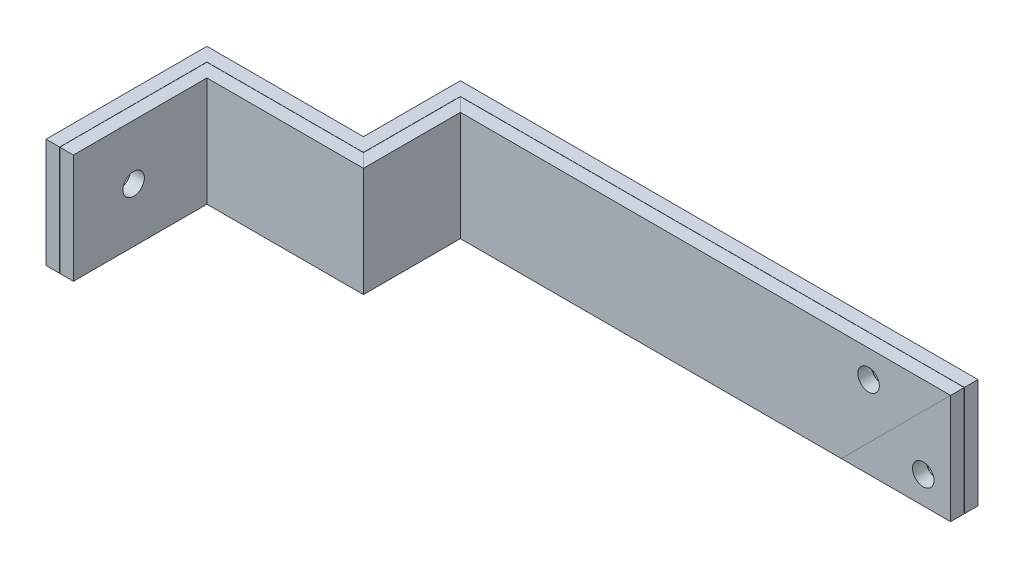
ISO-10303-21;
HEADER;
FILE_DESCRIPTION(('STEP AP214'),'2;1');
FILE_NAME('part.step','',(''),(''),'','','');
FILE_SCHEMA(('AUTOMOTIVE_DESIGN { 1 0 10303 214 1 1 1 1 }'));
ENDSEC;
DATA;
#1=APPLICATION_CONTEXT('core data for automotive mechanical design processes');
#2=APPLICATION_PROTOCOL_DEFINITION('international standard','automotive_design',2000,#1);
#3=PRODUCT_CONTEXT('',#1,'mechanical');
#4=PRODUCT('Part','Part','',(#3));
#5=PRODUCT_RELATED_PRODUCT_CATEGORY('part','',(#4));
#6=PRODUCT_DEFINITION_FORMATION('','',#4);
#7=PRODUCT_DEFINITION_CONTEXT('part definition',#1,'design');
#8=PRODUCT_DEFINITION('design','',#6,#7);
#9=PRODUCT_DEFINITION_SHAPE('','',#8);
#10=(LENGTH_UNIT() NAMED_UNIT(*) SI_UNIT(.MILLI.,.METRE.));
#11=(NAMED_UNIT(*) PLANE_ANGLE_UNIT() SI_UNIT($,.RADIAN.));
#12=(NAMED_UNIT(*) SI_UNIT($,.STERADIAN.) SOLID_ANGLE_UNIT());
#13=UNCERTAINTY_MEASURE_WITH_UNIT(LENGTH_MEASURE(1.E-05),#10,'distance_accuracy_value','');
#14=(GEOMETRIC_REPRESENTATION_CONTEXT(3) GLOBAL_UNCERTAINTY_ASSIGNED_CONTEXT((#13)) GLOBAL_UNIT_ASSIGNED_CONTEXT((#10,
#11,#12)) REPRESENTATION_CONTEXT('',''));
#15=CARTESIAN_POINT('',(0.,0.,0.));
#16=DIRECTION('',(0.,0.,1.));
#17=DIRECTION('',(1.,0.,0.));
#18=AXIS2_PLACEMENT_3D('',#15,#16,#17);
#19=CARTESIAN_POINT('',(-0.0999999999999925,25.4,65.155));
#20=DIRECTION('',(0.,0.,1.));
#21=DIRECTION('',(1.,0.,0.));
#22=AXIS2_PLACEMENT_3D('',#19,#20,#21);
#23=PLANE('',#22);
#24=DIRECTION('',(-1.,0.,0.));
#25=VECTOR('',#24,1.);
#26=CARTESIAN_POINT('',(-0.0999999999999925,-25.4,65.155));
#27=LINE('',#26,#25);
#28=CARTESIAN_POINT('',(-0.0999999999999925,-25.4,65.155));
#29=VERTEX_POINT('',#28);
#30=CARTESIAN_POINT('',(-6.41,-25.4,65.155));
#31=VERTEX_POINT('',#30);
#32=EDGE_CURVE('E182',#29,#31,#27,.T.);
#33=ORIENTED_EDGE('',*,*,#32,.F.);
#34=DIRECTION('',(0.,-1.,0.));
#35=VECTOR('',#34,1.);
#36=CARTESIAN_POINT('',(-0.0999999999999925,25.4,65.155));
#37=LINE('',#36,#35);
#38=CARTESIAN_POINT('',(-0.0999999999999925,25.4,65.155));
#39=VERTEX_POINT('',#38);
#40=EDGE_CURVE('E12',#39,#29,#37,.T.);
#41=ORIENTED_EDGE('',*,*,#40,.F.);
#42=DIRECTION('',(-1.,0.,0.));
#43=VECTOR('',#42,1.);
#44=CARTESIAN_POINT('',(-1.92553323385334,25.4,65.155));
#45=LINE('',#44,#43);
#46=CARTESIAN_POINT('',(-6.41,25.4,65.155));
#47=VERTEX_POINT('',#46);
#48=EDGE_CURVE('E65',#39,#47,#45,.T.);
#49=ORIENTED_EDGE('',*,*,#48,.T.);
#50=DIRECTION('',(0.,-1.,0.));
#51=VECTOR('',#50,1.);
#52=CARTESIAN_POINT('',(-6.41,25.4,65.155));
#53=LINE('',#52,#51);
#54=EDGE_CURVE('E112',#47,#31,#53,.T.);
#55=ORIENTED_EDGE('',*,*,#54,.T.);
#56=EDGE_LOOP('',(#33,#41,#49,#55));
#57=FACE_BOUND('',#56,.T.);
#58=ADVANCED_FACE('F46',(#57),#23,.T.);
#59=CARTESIAN_POINT('',(-0.0999999999999925,25.4,-3.255));
#60=DIRECTION('',(1.,0.,0.));
#61=DIRECTION('',(0.,0.,-1.));
#62=AXIS2_PLACEMENT_3D('',#59,#60,#61);
#63=PLANE('',#62);
#64=CARTESIAN_POINT('',(-0.0999999999999925,-0.172201783301577,37.1950000000231));
#65=DIRECTION('',(1.,0.,0.));
#66=DIRECTION('',(0.,0.,-1.));
#67=AXIS2_PLACEMENT_3D('',#64,#65,#66);
#68=CIRCLE('',#67,5.);
#69=CARTESIAN_POINT('',(-0.0999999999999925,-0.172201783301577,32.1950000000231));
#70=VERTEX_POINT('',#69);
#71=EDGE_CURVE('E162',#70,#70,#68,.T.);
#72=ORIENTED_EDGE('',*,*,#71,.F.);
#73=EDGE_LOOP('',(#72));
#74=FACE_BOUND('',#73,.T.);
#75=DIRECTION('',(0.,0.,1.));
#76=VECTOR('',#75,1.);
#77=CARTESIAN_POINT('',(-0.0999999999999925,-25.4,-3.255));
#78=LINE('',#77,#76);
#79=CARTESIAN_POINT('',(-0.0999999999999925,-25.4,-3.255));
#80=VERTEX_POINT('',#79);
#81=EDGE_CURVE('E180',#80,#29,#78,.T.);
#82=ORIENTED_EDGE('',*,*,#81,.F.);
#83=DIRECTION('',(0.,-1.,0.));
#84=VECTOR('',#83,1.);
#85=CARTESIAN_POINT('',(-0.0999999999999925,25.4,-3.255));
#86=LINE('',#85,#84);
#87=CARTESIAN_POINT('',(-0.0999999999999925,25.4,-3.255));
#88=VERTEX_POINT('',#87);
#89=EDGE_CURVE('E56',#88,#80,#86,.T.);
#90=ORIENTED_EDGE('',*,*,#89,.F.);
#91=DIRECTION('',(0.,0.,1.));
#92=VECTOR('',#91,1.);
#93=CARTESIAN_POINT('',(-0.0999999999999925,25.4,-3.255));
#94=LINE('',#93,#92);
#95=EDGE_CURVE('E148',#88,#39,#94,.T.);
#96=ORIENTED_EDGE('',*,*,#95,.T.);
#97=ORIENTED_EDGE('',*,*,#40,.T.);
#98=EDGE_LOOP('',(#82,#90,#96,#97));
#99=FACE_BOUND('',#98,.T.);
#100=ADVANCED_FACE('F246',(#74,#99),#63,.T.);
#101=CARTESIAN_POINT('',(-0.0999999999999925,25.4,-3.255));
#102=DIRECTION('',(0.,0.,1.));
#103=DIRECTION('',(1.,0.,0.));
#104=AXIS2_PLACEMENT_3D('',#101,#102,#103);
#105=PLANE('',#104);
#106=DIRECTION('',(-1.,0.,0.));
#107=VECTOR('',#106,1.);
#108=CARTESIAN_POINT('',(-0.0999999999999925,-25.4,-3.255));
#109=LINE('',#108,#107);
#110=CARTESIAN_POINT('',(72.585,-25.4,-3.255));
#111=VERTEX_POINT('',#110);
#112=EDGE_CURVE('E136',#111,#80,#109,.T.);
#113=ORIENTED_EDGE('',*,*,#112,.F.);
#114=DIRECTION('',(0.,-1.,0.));
#115=VECTOR('',#114,1.);
#116=CARTESIAN_POINT('',(72.585,25.4,-3.255));
#117=LINE('',#116,#115);
#118=CARTESIAN_POINT('',(72.585,25.4,-3.255));
#119=VERTEX_POINT('',#118);
#120=EDGE_CURVE('E131',#119,#111,#117,.T.);
#121=ORIENTED_EDGE('',*,*,#120,.F.);
#122=DIRECTION('',(-1.,0.,0.));
#123=VECTOR('',#122,1.);
#124=CARTESIAN_POINT('',(-0.0999999999999925,25.4,-3.255));
#125=LINE('',#124,#123);
#126=EDGE_CURVE('E134',#119,#88,#125,.T.);
#127=ORIENTED_EDGE('',*,*,#126,.T.);
#128=ORIENTED_EDGE('',*,*,#89,.T.);
#129=EDGE_LOOP('',(#113,#121,#127,#128));
#130=FACE_BOUND('',#129,.T.);
#131=ADVANCED_FACE('F133',(#130),#105,.T.);
#132=CARTESIAN_POINT('',(72.585,25.4,-3.255));
#133=DIRECTION('',(1.,0.,0.));
#134=DIRECTION('',(0.,0.,-1.));
#135=AXIS2_PLACEMENT_3D('',#132,#133,#134);
#136=PLANE('',#135);
#137=DIRECTION('',(0.,0.,1.));
#138=VECTOR('',#137,1.);
#139=CARTESIAN_POINT('',(72.585,-25.4,-3.255));
#140=LINE('',#139,#138);
#141=CARTESIAN_POINT('',(72.585,-25.4,-48.255));
#142=VERTEX_POINT('',#141);
#143=EDGE_CURVE('E177',#142,#111,#140,.T.);
#144=ORIENTED_EDGE('',*,*,#143,.F.);
#145=DIRECTION('',(0.,-1.,0.));
#146=VECTOR('',#145,1.);
#147=CARTESIAN_POINT('',(72.585,25.4,-48.255));
#148=LINE('',#147,#146);
#149=CARTESIAN_POINT('',(72.585,25.4,-48.255));
#150=VERTEX_POINT('',#149);
#151=EDGE_CURVE('E141',#150,#142,#148,.T.);
#152=ORIENTED_EDGE('',*,*,#151,.F.);
#153=DIRECTION('',(0.,0.,1.));
#154=VECTOR('',#153,1.);
#155=CARTESIAN_POINT('',(72.585,25.4,-3.255));
#156=LINE('',#155,#154);
#157=EDGE_CURVE('E146',#150,#119,#156,.T.);
#158=ORIENTED_EDGE('',*,*,#157,.T.);
#159=ORIENTED_EDGE('',*,*,#120,.T.);
#160=EDGE_LOOP('',(#144,#152,#158,#159));
#161=FACE_BOUND('',#160,.T.);
#162=ADVANCED_FACE('F150',(#161),#136,.T.);
#163=CARTESIAN_POINT('',(72.585,25.4,-48.255));
#164=DIRECTION('',(0.,0.,1.));
#165=DIRECTION('',(1.,0.,0.));
#166=AXIS2_PLACEMENT_3D('',#163,#164,#165);
#167=PLANE('',#166);
#168=CARTESIAN_POINT('',(293.93,-12.7,-48.255));
#169=DIRECTION('',(0.,0.,1.));
#170=DIRECTION('',(1.,0.,0.));
#171=AXIS2_PLACEMENT_3D('',#168,#169,#170);
#172=CIRCLE('',#171,4.99999999999999);
#173=CARTESIAN_POINT('',(298.93,-12.7,-48.255));
#174=VERTEX_POINT('',#173);
#175=EDGE_CURVE('E199',#174,#174,#172,.T.);
#176=ORIENTED_EDGE('',*,*,#175,.F.);
#177=EDGE_LOOP('',(#176));
#178=FACE_BOUND('',#177,.T.);
#179=CARTESIAN_POINT('',(268.53,12.7,-48.255));
#180=DIRECTION('',(0.,0.,1.));
#181=DIRECTION('',(1.,0.,0.));
#182=AXIS2_PLACEMENT_3D('',#179,#180,#181);
#183=CIRCLE('',#182,4.99999999999999);
#184=CARTESIAN_POINT('',(273.53,12.7,-48.255));
#185=VERTEX_POINT('',#184);
#186=EDGE_CURVE('E202',#185,#185,#183,.T.);
#187=ORIENTED_EDGE('',*,*,#186,.F.);
#188=EDGE_LOOP('',(#187));
#189=FACE_BOUND('',#188,.T.);
#190=DIRECTION('',(-1.,0.,0.));
#191=VECTOR('',#190,1.);
#192=CARTESIAN_POINT('',(72.585,-25.4,-48.255));
#193=LINE('',#192,#191);
#194=CARTESIAN_POINT('',(306.63,-25.4,-48.255));
#195=VERTEX_POINT('',#194);
#196=EDGE_CURVE('E174',#195,#142,#193,.T.);
#197=ORIENTED_EDGE('',*,*,#196,.F.);
#198=DIRECTION('',(0.,-1.,0.));
#199=VECTOR('',#198,1.);
#200=CARTESIAN_POINT('',(306.63,25.4,-48.255));
#201=LINE('',#200,#199);
#202=CARTESIAN_POINT('',(306.63,25.4,-48.255));
#203=VERTEX_POINT('',#202);
#204=EDGE_CURVE('E186',#203,#195,#201,.T.);
#205=ORIENTED_EDGE('',*,*,#204,.F.);
#206=DIRECTION('',(-1.,0.,0.));
#207=VECTOR('',#206,1.);
#208=CARTESIAN_POINT('',(72.585,25.4,-48.255));
#209=LINE('',#208,#207);
#210=EDGE_CURVE('E151',#203,#150,#209,.T.);
#211=ORIENTED_EDGE('',*,*,#210,.T.);
#212=ORIENTED_EDGE('',*,*,#151,.T.);
#213=EDGE_LOOP('',(#197,#205,#211,#212));
#214=FACE_BOUND('',#213,.T.);
#215=ADVANCED_FACE('F250',(#178,#189,#214),#167,.T.);
#216=CARTESIAN_POINT('',(306.63,25.4,-48.255));
#217=DIRECTION('',(1.,0.,0.));
#218=DIRECTION('',(0.,0.,-1.));
#219=AXIS2_PLACEMENT_3D('',#216,#217,#218);
#220=PLANE('',#219);
#221=DIRECTION('',(0.,0.,1.));
#222=VECTOR('',#221,1.);
#223=CARTESIAN_POINT('',(306.63,-25.4,-48.255));
#224=LINE('',#223,#222);
#225=CARTESIAN_POINT('',(306.63,-25.4,-54.565));
#226=VERTEX_POINT('',#225);
#227=EDGE_CURVE('E171',#226,#195,#224,.T.);
#228=ORIENTED_EDGE('',*,*,#227,.F.);
#229=DIRECTION('',(0.,-1.,0.));
#230=VECTOR('',#229,1.);
#231=CARTESIAN_POINT('',(306.63,25.4,-54.565));
#232=LINE('',#231,#230);
#233=CARTESIAN_POINT('',(306.63,25.4,-54.565));
#234=VERTEX_POINT('',#233);
#235=EDGE_CURVE('E188',#234,#226,#232,.T.);
#236=ORIENTED_EDGE('',*,*,#235,.F.);
#237=DIRECTION('',(0.,0.,1.));
#238=VECTOR('',#237,1.);
#239=CARTESIAN_POINT('',(306.63,25.4,-48.255));
#240=LINE('',#239,#238);
#241=EDGE_CURVE('E153',#234,#203,#240,.T.);
#242=ORIENTED_EDGE('',*,*,#241,.T.);
#243=ORIENTED_EDGE('',*,*,#204,.T.);
#244=EDGE_LOOP('',(#228,#236,#242,#243));
#245=FACE_BOUND('',#244,.T.);
#246=ADVANCED_FACE('F230',(#245),#220,.T.);
#247=CARTESIAN_POINT('',(66.275,25.4,-54.565));
#248=DIRECTION('',(0.,0.,-1.));
#249=DIRECTION('',(-1.,0.,0.));
#250=AXIS2_PLACEMENT_3D('',#247,#248,#249);
#251=PLANE('',#250);
#252=CARTESIAN_POINT('',(293.93,-12.7,-54.565));
#253=DIRECTION('',(0.,0.,-1.));
#254=DIRECTION('',(-1.,0.,0.));
#255=AXIS2_PLACEMENT_3D('',#252,#253,#254);
#256=CIRCLE('',#255,4.99999999999999);
#257=CARTESIAN_POINT('',(288.93,-12.7,-54.565));
#258=VERTEX_POINT('',#257);
#259=EDGE_CURVE('E50',#258,#258,#256,.T.);
#260=ORIENTED_EDGE('',*,*,#259,.F.);
#261=EDGE_LOOP('',(#260));
#262=FACE_BOUND('',#261,.T.);
#263=CARTESIAN_POINT('',(268.53,12.7,-54.565));
#264=DIRECTION('',(0.,0.,-1.));
#265=DIRECTION('',(-1.,0.,0.));
#266=AXIS2_PLACEMENT_3D('',#263,#264,#265);
#267=CIRCLE('',#266,4.99999999999999);
#268=CARTESIAN_POINT('',(263.53,12.7,-54.565));
#269=VERTEX_POINT('',#268);
#270=EDGE_CURVE('E200',#269,#269,#267,.T.);
#271=ORIENTED_EDGE('',*,*,#270,.F.);
#272=EDGE_LOOP('',(#271));
#273=FACE_BOUND('',#272,.T.);
#274=DIRECTION('',(1.,0.,0.));
#275=VECTOR('',#274,1.);
#276=CARTESIAN_POINT('',(66.275,-25.4,-54.565));
#277=LINE('',#276,#275);
#278=CARTESIAN_POINT('',(66.275,-25.4,-54.565));
#279=VERTEX_POINT('',#278);
#280=EDGE_CURVE('E168',#279,#226,#277,.T.);
#281=ORIENTED_EDGE('',*,*,#280,.F.);
#282=DIRECTION('',(0.,-1.,0.));
#283=VECTOR('',#282,1.);
#284=CARTESIAN_POINT('',(66.275,25.4,-54.565));
#285=LINE('',#284,#283);
#286=CARTESIAN_POINT('',(66.275,25.4,-54.565));
#287=VERTEX_POINT('',#286);
#288=EDGE_CURVE('E190',#287,#279,#285,.T.);
#289=ORIENTED_EDGE('',*,*,#288,.F.);
#290=DIRECTION('',(1.,0.,0.));
#291=VECTOR('',#290,1.);
#292=CARTESIAN_POINT('',(66.275,25.4,-54.565));
#293=LINE('',#292,#291);
#294=EDGE_CURVE('E224',#287,#234,#293,.T.);
#295=ORIENTED_EDGE('',*,*,#294,.T.);
#296=ORIENTED_EDGE('',*,*,#235,.T.);
#297=EDGE_LOOP('',(#281,#289,#295,#296));
#298=FACE_BOUND('',#297,.T.);
#299=ADVANCED_FACE('F236',(#262,#273,#298),#251,.T.);
#300=CARTESIAN_POINT('',(66.275,25.4,-9.565));
#301=DIRECTION('',(-1.,0.,0.));
#302=DIRECTION('',(0.,0.,1.));
#303=AXIS2_PLACEMENT_3D('',#300,#301,#302);
#304=PLANE('',#303);
#305=DIRECTION('',(0.,0.,-1.));
#306=VECTOR('',#305,1.);
#307=CARTESIAN_POINT('',(66.275,-25.4,-9.565));
#308=LINE('',#307,#306);
#309=CARTESIAN_POINT('',(66.275,-25.4,-9.565));
#310=VERTEX_POINT('',#309);
#311=EDGE_CURVE('E165',#310,#279,#308,.T.);
#312=ORIENTED_EDGE('',*,*,#311,.F.);
#313=DIRECTION('',(0.,-1.,0.));
#314=VECTOR('',#313,1.);
#315=CARTESIAN_POINT('',(66.275,25.4,-9.565));
#316=LINE('',#315,#314);
#317=CARTESIAN_POINT('',(66.275,25.4,-9.565));
#318=VERTEX_POINT('',#317);
#319=EDGE_CURVE('E192',#318,#310,#316,.T.);
#320=ORIENTED_EDGE('',*,*,#319,.F.);
#321=DIRECTION('',(0.,0.,-1.));
#322=VECTOR('',#321,1.);
#323=CARTESIAN_POINT('',(66.275,25.4,-9.565));
#324=LINE('',#323,#322);
#325=EDGE_CURVE('E221',#318,#287,#324,.T.);
#326=ORIENTED_EDGE('',*,*,#325,.T.);
#327=ORIENTED_EDGE('',*,*,#288,.T.);
#328=EDGE_LOOP('',(#312,#320,#326,#327));
#329=FACE_BOUND('',#328,.T.);
#330=ADVANCED_FACE('F239',(#329),#304,.T.);
#331=CARTESIAN_POINT('',(-6.40999999999999,25.4,-9.565));
#332=DIRECTION('',(0.,0.,-1.));
#333=DIRECTION('',(-1.,0.,0.));
#334=AXIS2_PLACEMENT_3D('',#331,#332,#333);
#335=PLANE('',#334);
#336=DIRECTION('',(1.,0.,0.));
#337=VECTOR('',#336,1.);
#338=CARTESIAN_POINT('',(-6.40999999999999,-25.4,-9.565));
#339=LINE('',#338,#337);
#340=CARTESIAN_POINT('',(-6.40999999999999,-25.4,-9.565));
#341=VERTEX_POINT('',#340);
#342=EDGE_CURVE('E161',#341,#310,#339,.T.);
#343=ORIENTED_EDGE('',*,*,#342,.F.);
#344=DIRECTION('',(0.,-1.,0.));
#345=VECTOR('',#344,1.);
#346=CARTESIAN_POINT('',(-6.40999999999999,25.4,-9.565));
#347=LINE('',#346,#345);
#348=CARTESIAN_POINT('',(-6.40999999999999,25.4,-9.565));
#349=VERTEX_POINT('',#348);
#350=EDGE_CURVE('E194',#349,#341,#347,.T.);
#351=ORIENTED_EDGE('',*,*,#350,.F.);
#352=DIRECTION('',(1.,0.,0.));
#353=VECTOR('',#352,1.);
#354=CARTESIAN_POINT('',(-6.40999999999999,25.4,-9.565));
#355=LINE('',#354,#353);
#356=EDGE_CURVE('E218',#349,#318,#355,.T.);
#357=ORIENTED_EDGE('',*,*,#356,.T.);
#358=ORIENTED_EDGE('',*,*,#319,.T.);
#359=EDGE_LOOP('',(#343,#351,#357,#358));
#360=FACE_BOUND('',#359,.T.);
#361=ADVANCED_FACE('F243',(#360),#335,.T.);
#362=CARTESIAN_POINT('',(-6.41,25.4,65.155));
#363=DIRECTION('',(-1.,0.,0.));
#364=DIRECTION('',(0.,0.,1.));
#365=AXIS2_PLACEMENT_3D('',#362,#363,#364);
#366=PLANE('',#365);
#367=CARTESIAN_POINT('',(-6.41,-0.172201783301577,37.1950000000231));
#368=DIRECTION('',(-1.,0.,0.));
#369=DIRECTION('',(0.,0.,1.));
#370=AXIS2_PLACEMENT_3D('',#367,#368,#369);
#371=CIRCLE('',#370,5.);
#372=CARTESIAN_POINT('',(-6.41,-0.172201783301577,42.1950000000231));
#373=VERTEX_POINT('',#372);
#374=EDGE_CURVE('E197',#373,#373,#371,.T.);
#375=ORIENTED_EDGE('',*,*,#374,.F.);
#376=EDGE_LOOP('',(#375));
#377=FACE_BOUND('',#376,.T.);
#378=DIRECTION('',(0.,0.,-1.));
#379=VECTOR('',#378,1.);
#380=CARTESIAN_POINT('',(-6.41,-25.4,65.155));
#381=LINE('',#380,#379);
#382=EDGE_CURVE('E158',#31,#341,#381,.T.);
#383=ORIENTED_EDGE('',*,*,#382,.F.);
#384=ORIENTED_EDGE('',*,*,#54,.F.);
#385=DIRECTION('',(0.,0.,-1.));
#386=VECTOR('',#385,1.);
#387=CARTESIAN_POINT('',(-6.41,25.4,65.155));
#388=LINE('',#387,#386);
#389=EDGE_CURVE('E216',#47,#349,#388,.T.);
#390=ORIENTED_EDGE('',*,*,#389,.T.);
#391=ORIENTED_EDGE('',*,*,#350,.T.);
#392=EDGE_LOOP('',(#383,#384,#390,#391));
#393=FACE_BOUND('',#392,.T.);
#394=ADVANCED_FACE('F48',(#377,#393),#366,.T.);
#395=CARTESIAN_POINT('',(0.,25.4,0.));
#396=DIRECTION('',(0.,-1.,0.));
#397=DIRECTION('',(0.,0.,-1.));
#398=AXIS2_PLACEMENT_3D('',#395,#396,#397);
#399=PLANE('',#398);
#400=ORIENTED_EDGE('',*,*,#48,.F.);
#401=ORIENTED_EDGE('',*,*,#95,.F.);
#402=ORIENTED_EDGE('',*,*,#126,.F.);
#403=ORIENTED_EDGE('',*,*,#157,.F.);
#404=ORIENTED_EDGE('',*,*,#210,.F.);
#405=ORIENTED_EDGE('',*,*,#241,.F.);
#406=ORIENTED_EDGE('',*,*,#294,.F.);
#407=ORIENTED_EDGE('',*,*,#325,.F.);
#408=ORIENTED_EDGE('',*,*,#356,.F.);
#409=ORIENTED_EDGE('',*,*,#389,.F.);
#410=EDGE_LOOP('',(#400,#401,#402,#403,#404,#405,#406,#407,#408,#409));
#411=FACE_BOUND('',#410,.T.);
#412=ADVANCED_FACE('F144',(#411),#399,.F.);
#413=CARTESIAN_POINT('',(0.,-25.4,0.));
#414=DIRECTION('',(0.,-1.,0.));
#415=DIRECTION('',(0.,0.,-1.));
#416=AXIS2_PLACEMENT_3D('',#413,#414,#415);
#417=PLANE('',#416);
#418=ORIENTED_EDGE('',*,*,#32,.T.);
#419=ORIENTED_EDGE('',*,*,#382,.T.);
#420=ORIENTED_EDGE('',*,*,#342,.T.);
#421=ORIENTED_EDGE('',*,*,#311,.T.);
#422=ORIENTED_EDGE('',*,*,#280,.T.);
#423=ORIENTED_EDGE('',*,*,#227,.T.);
#424=ORIENTED_EDGE('',*,*,#196,.T.);
#425=ORIENTED_EDGE('',*,*,#143,.T.);
#426=ORIENTED_EDGE('',*,*,#112,.T.);
#427=ORIENTED_EDGE('',*,*,#81,.T.);
#428=EDGE_LOOP('',(#418,#419,#420,#421,#422,#423,#424,#425,#426,#427));
#429=FACE_BOUND('',#428,.T.);
#430=ADVANCED_FACE('F248',(#429),#417,.T.);
#431=CARTESIAN_POINT('',(-18.215,-0.172201783301577,37.1950000000231));
#432=DIRECTION('',(1.,0.,0.));
#433=DIRECTION('',(0.,0.,-1.));
#434=AXIS2_PLACEMENT_3D('',#431,#432,#433);
#435=CYLINDRICAL_SURFACE('',#434,5.);
#436=ORIENTED_EDGE('',*,*,#71,.T.);
#437=EDGE_LOOP('',(#436));
#438=FACE_BOUND('',#437,.T.);
#439=ORIENTED_EDGE('',*,*,#374,.T.);
#440=EDGE_LOOP('',(#439));
#441=FACE_BOUND('',#440,.T.);
#442=ADVANCED_FACE('F324',(#438,#441),#435,.F.);
#443=CARTESIAN_POINT('',(268.53,12.7,-76.845));
#444=DIRECTION('',(0.,0.,1.));
#445=DIRECTION('',(1.,0.,0.));
#446=AXIS2_PLACEMENT_3D('',#443,#444,#445);
#447=CYLINDRICAL_SURFACE('',#446,4.99999999999999);
#448=ORIENTED_EDGE('',*,*,#186,.T.);
#449=EDGE_LOOP('',(#448));
#450=FACE_BOUND('',#449,.T.);
#451=ORIENTED_EDGE('',*,*,#270,.T.);
#452=EDGE_LOOP('',(#451));
#453=FACE_BOUND('',#452,.T.);
#454=ADVANCED_FACE('F345',(#450,#453),#447,.F.);
#455=CARTESIAN_POINT('',(293.93,-12.7,-76.845));
#456=DIRECTION('',(0.,0.,1.));
#457=DIRECTION('',(1.,0.,0.));
#458=AXIS2_PLACEMENT_3D('',#455,#456,#457);
#459=CYLINDRICAL_SURFACE('',#458,4.99999999999999);
#460=ORIENTED_EDGE('',*,*,#175,.T.);
#461=EDGE_LOOP('',(#460));
#462=FACE_BOUND('',#461,.T.);
#463=ORIENTED_EDGE('',*,*,#259,.T.);
#464=EDGE_LOOP('',(#463));
#465=FACE_BOUND('',#464,.T.);
#466=ADVANCED_FACE('F366',(#462,#465),#459,.F.);
#467=CLOSED_SHELL('',(#58,#100,#131,#162,#215,#246,#299,#330,#361,#394,#412,#430,#442,#454,#466));
#468=MANIFOLD_SOLID_BREP('B2',#467);
#469=CARTESIAN_POINT('',(0.,0.,0.));
#470=DIRECTION('',(1.,0.,0.));
#471=DIRECTION('',(0.,0.,-1.));
#472=AXIS2_PLACEMENT_3D('',#469,#470,#471);
#473=PLANE('',#472);
#474=CARTESIAN_POINT('',(0.,-0.172201783301577,37.1950000000231));
#475=DIRECTION('',(1.,0.,0.));
#476=DIRECTION('',(0.,0.,-1.));
#477=AXIS2_PLACEMENT_3D('',#474,#475,#476);
#478=CIRCLE('',#477,5.);
#479=CARTESIAN_POINT('',(0.,-0.172201783301577,32.1950000000231));
#480=VERTEX_POINT('',#479);
#481=EDGE_CURVE('E643',#480,#480,#478,.T.);
#482=ORIENTED_EDGE('',*,*,#481,.T.);
#483=EDGE_LOOP('',(#482));
#484=FACE_BOUND('',#483,.T.);
#485=DIRECTION('',(0.,-1.,0.));
#486=VECTOR('',#485,1.);
#487=CARTESIAN_POINT('',(0.,25.4,65.155));
#488=LINE('',#487,#486);
#489=CARTESIAN_POINT('',(0.,25.4,65.155));
#490=VERTEX_POINT('',#489);
#491=CARTESIAN_POINT('',(0.,-25.4,65.155));
#492=VERTEX_POINT('',#491);
#493=EDGE_CURVE('E609',#490,#492,#488,.T.);
#494=ORIENTED_EDGE('',*,*,#493,.F.);
#495=DIRECTION('',(0.,0.,1.));
#496=VECTOR('',#495,1.);
#497=CARTESIAN_POINT('',(0.,25.4,3.155));
#498=LINE('',#497,#496);
#499=CARTESIAN_POINT('',(0.,25.4,-3.155));
#500=VERTEX_POINT('',#499);
#501=EDGE_CURVE('E549',#500,#490,#498,.T.);
#502=ORIENTED_EDGE('',*,*,#501,.F.);
#503=DIRECTION('',(0.,1.,0.));
#504=VECTOR('',#503,1.);
#505=CARTESIAN_POINT('',(0.,25.4,-3.155));
#506=LINE('',#505,#504);
#507=CARTESIAN_POINT('',(0.,-25.4,-3.155));
#508=VERTEX_POINT('',#507);
#509=EDGE_CURVE('E602',#508,#500,#506,.T.);
#510=ORIENTED_EDGE('',*,*,#509,.F.);
#511=DIRECTION('',(0.,0.,-1.));
#512=VECTOR('',#511,1.);
#513=CARTESIAN_POINT('',(0.,-25.4,3.155));
#514=LINE('',#513,#512);
#515=EDGE_CURVE('E577',#492,#508,#514,.T.);
#516=ORIENTED_EDGE('',*,*,#515,.F.);
#517=EDGE_LOOP('',(#494,#502,#510,#516));
#518=FACE_BOUND('',#517,.T.);
#519=ADVANCED_FACE('F399',(#484,#518),#473,.F.);
#520=CARTESIAN_POINT('',(306.63,28.0399999999999,-41.845));
#521=DIRECTION('',(0.,0.,1.));
#522=DIRECTION('',(1.,0.,0.));
#523=AXIS2_PLACEMENT_3D('',#520,#521,#522);
#524=PLANE('',#523);
#525=CARTESIAN_POINT('',(293.93,-12.7,-41.845));
#526=DIRECTION('',(0.,0.,1.));
#527=DIRECTION('',(1.,0.,0.));
#528=AXIS2_PLACEMENT_3D('',#525,#526,#527);
#529=CIRCLE('',#528,4.99999999999999);
#530=CARTESIAN_POINT('',(298.93,-12.7,-41.845));
#531=VERTEX_POINT('',#530);
#532=EDGE_CURVE('E690',#531,#531,#529,.T.);
#533=ORIENTED_EDGE('',*,*,#532,.F.);
#534=EDGE_LOOP('',(#533));
#535=FACE_BOUND('',#534,.T.);
#536=DIRECTION('',(-1.,0.,0.));
#537=VECTOR('',#536,1.);
#538=CARTESIAN_POINT('',(306.63,-25.4000000000001,-41.845));
#539=LINE('',#538,#537);
#540=CARTESIAN_POINT('',(306.63,-25.4000000000001,-41.845));
#541=VERTEX_POINT('',#540);
#542=CARTESIAN_POINT('',(255.83,-25.4000000000001,-41.845));
#543=VERTEX_POINT('',#542);
#544=EDGE_CURVE('E511',#541,#543,#539,.T.);
#545=ORIENTED_EDGE('',*,*,#544,.F.);
#546=DIRECTION('',(0.,-1.,0.));
#547=VECTOR('',#546,1.);
#548=CARTESIAN_POINT('',(306.63,28.0399999999999,-41.845));
#549=LINE('',#548,#547);
#550=CARTESIAN_POINT('',(306.63,25.4,-41.845));
#551=VERTEX_POINT('',#550);
#552=EDGE_CURVE('E477',#551,#541,#549,.T.);
#553=ORIENTED_EDGE('',*,*,#552,.F.);
#554=DIRECTION('',(0.707106781186548,0.707106781186548,0.));
#555=VECTOR('',#554,1.);
#556=CARTESIAN_POINT('',(189.44975,-91.78025,-41.845));
#557=LINE('',#556,#555);
#558=EDGE_CURVE('E488',#543,#551,#557,.T.);
#559=ORIENTED_EDGE('',*,*,#558,.F.);
#560=EDGE_LOOP('',(#545,#553,#559));
#561=FACE_BOUND('',#560,.T.);
#562=ADVANCED_FACE('F509',(#535,#561),#524,.T.);
#563=CARTESIAN_POINT('',(306.63,28.0399999999999,-48.155));
#564=DIRECTION('',(0.,0.,-1.));
#565=DIRECTION('',(-1.,0.,0.));
#566=AXIS2_PLACEMENT_3D('',#563,#564,#565);
#567=PLANE('',#566);
#568=CARTESIAN_POINT('',(293.93,-12.7,-48.155));
#569=DIRECTION('',(0.,0.,-1.));
#570=DIRECTION('',(-1.,0.,0.));
#571=AXIS2_PLACEMENT_3D('',#568,#569,#570);
#572=CIRCLE('',#571,4.99999999999999);
#573=CARTESIAN_POINT('',(288.93,-12.7,-48.155));
#574=VERTEX_POINT('',#573);
#575=EDGE_CURVE('E402',#574,#574,#572,.T.);
#576=ORIENTED_EDGE('',*,*,#575,.F.);
#577=EDGE_LOOP('',(#576));
#578=FACE_BOUND('',#577,.T.);
#579=DIRECTION('',(1.,0.,0.));
#580=VECTOR('',#579,1.);
#581=CARTESIAN_POINT('',(255.83,-25.4,-48.155));
#582=LINE('',#581,#580);
#583=CARTESIAN_POINT('',(255.83,-25.4,-48.155));
#584=VERTEX_POINT('',#583);
#585=CARTESIAN_POINT('',(306.63,-25.4000000000001,-48.155));
#586=VERTEX_POINT('',#585);
#587=EDGE_CURVE('E461',#584,#586,#582,.T.);
#588=ORIENTED_EDGE('',*,*,#587,.F.);
#589=DIRECTION('',(-0.707106781186548,-0.707106781186548,0.));
#590=VECTOR('',#589,1.);
#591=CARTESIAN_POINT('',(189.44975,-91.78025,-48.155));
#592=LINE('',#591,#590);
#593=CARTESIAN_POINT('',(306.63,25.4,-48.155));
#594=VERTEX_POINT('',#593);
#595=EDGE_CURVE('E454',#594,#584,#592,.T.);
#596=ORIENTED_EDGE('',*,*,#595,.F.);
#597=DIRECTION('',(0.,-1.,0.));
#598=VECTOR('',#597,1.);
#599=CARTESIAN_POINT('',(306.63,28.0399999999999,-48.155));
#600=LINE('',#599,#598);
#601=EDGE_CURVE('E458',#594,#586,#600,.T.);
#602=ORIENTED_EDGE('',*,*,#601,.T.);
#603=EDGE_LOOP('',(#588,#596,#602));
#604=FACE_BOUND('',#603,.T.);
#605=ADVANCED_FACE('F456',(#578,#604),#567,.T.);
#606=CARTESIAN_POINT('',(306.63,28.0399999999999,-41.845));
#607=DIRECTION('',(1.,0.,0.));
#608=DIRECTION('',(0.,0.,-1.));
#609=AXIS2_PLACEMENT_3D('',#606,#607,#608);
#610=PLANE('',#609);
#611=DIRECTION('',(0.,0.,-1.));
#612=VECTOR('',#611,1.);
#613=CARTESIAN_POINT('',(306.63,-25.4000000000001,18.845));
#614=LINE('',#613,#612);
#615=EDGE_CURVE('E476',#541,#586,#614,.T.);
#616=ORIENTED_EDGE('',*,*,#615,.T.);
#617=ORIENTED_EDGE('',*,*,#601,.F.);
#618=DIRECTION('',(0.,0.,-1.));
#619=VECTOR('',#618,1.);
#620=CARTESIAN_POINT('',(306.63,25.4,-41.845));
#621=LINE('',#620,#619);
#622=EDGE_CURVE('E467',#551,#594,#621,.T.);
#623=ORIENTED_EDGE('',*,*,#622,.F.);
#624=ORIENTED_EDGE('',*,*,#552,.T.);
#625=EDGE_LOOP('',(#616,#617,#623,#624));
#626=FACE_BOUND('',#625,.T.);
#627=ADVANCED_FACE('F472',(#626),#610,.T.);
#628=CARTESIAN_POINT('',(72.2695,25.4,-41.845));
#629=DIRECTION('',(0.,1.,0.));
#630=DIRECTION('',(0.,0.,1.));
#631=AXIS2_PLACEMENT_3D('',#628,#629,#630);
#632=PLANE('',#631);
#633=DIRECTION('',(1.,0.,0.));
#634=VECTOR('',#633,1.);
#635=CARTESIAN_POINT('',(72.2695,25.4,-41.845));
#636=LINE('',#635,#634);
#637=CARTESIAN_POINT('',(78.995,25.4,-41.845));
#638=VERTEX_POINT('',#637);
#639=EDGE_CURVE('E487',#638,#551,#636,.T.);
#640=ORIENTED_EDGE('',*,*,#639,.T.);
#641=ORIENTED_EDGE('',*,*,#622,.T.);
#642=DIRECTION('',(1.,0.,0.));
#643=VECTOR('',#642,1.);
#644=CARTESIAN_POINT('',(72.2695,25.4,-48.155));
#645=LINE('',#644,#643);
#646=CARTESIAN_POINT('',(72.685,25.4,-48.155));
#647=VERTEX_POINT('',#646);
#648=EDGE_CURVE('E484',#647,#594,#645,.T.);
#649=ORIENTED_EDGE('',*,*,#648,.F.);
#650=DIRECTION('',(-0.707106781186548,0.,-0.707106781186548));
#651=VECTOR('',#650,1.);
#652=CARTESIAN_POINT('',(101.70275,25.4,-19.13725));
#653=LINE('',#652,#651);
#654=EDGE_CURVE('E579',#638,#647,#653,.T.);
#655=ORIENTED_EDGE('',*,*,#654,.F.);
#656=EDGE_LOOP('',(#640,#641,#649,#655));
#657=FACE_BOUND('',#656,.T.);
#658=ADVANCED_FACE('F483',(#657),#632,.T.);
#659=CARTESIAN_POINT('',(72.2695,25.4,-48.155));
#660=DIRECTION('',(0.,0.,-1.));
#661=DIRECTION('',(0.,1.,0.));
#662=AXIS2_PLACEMENT_3D('',#659,#660,#661);
#663=PLANE('',#662);
#664=CARTESIAN_POINT('',(268.53,12.7,-48.155));
#665=DIRECTION('',(0.,0.,-1.));
#666=DIRECTION('',(0.,1.,0.));
#667=AXIS2_PLACEMENT_3D('',#664,#665,#666);
#668=CIRCLE('',#667,4.99999999999999);
#669=CARTESIAN_POINT('',(268.53,17.7,-48.155));
#670=VERTEX_POINT('',#669);
#671=EDGE_CURVE('E693',#670,#670,#668,.T.);
#672=ORIENTED_EDGE('',*,*,#671,.F.);
#673=EDGE_LOOP('',(#672));
#674=FACE_BOUND('',#673,.T.);
#675=ORIENTED_EDGE('',*,*,#648,.T.);
#676=ORIENTED_EDGE('',*,*,#595,.T.);
#677=DIRECTION('',(1.,0.,0.));
#678=VECTOR('',#677,1.);
#679=CARTESIAN_POINT('',(72.2695,-25.4,-48.155));
#680=LINE('',#679,#678);
#681=CARTESIAN_POINT('',(72.685,-25.4,-48.155));
#682=VERTEX_POINT('',#681);
#683=EDGE_CURVE('E493',#682,#584,#680,.T.);
#684=ORIENTED_EDGE('',*,*,#683,.F.);
#685=DIRECTION('',(0.,-1.,0.));
#686=VECTOR('',#685,1.);
#687=CARTESIAN_POINT('',(72.685,25.4,-48.155));
#688=LINE('',#687,#686);
#689=EDGE_CURVE('E492',#647,#682,#688,.T.);
#690=ORIENTED_EDGE('',*,*,#689,.F.);
#691=EDGE_LOOP('',(#675,#676,#684,#690));
#692=FACE_BOUND('',#691,.T.);
#693=ADVANCED_FACE('F490',(#674,#692),#663,.T.);
#694=CARTESIAN_POINT('',(72.2695,-25.4,-41.845));
#695=DIRECTION('',(0.,-1.,0.));
#696=DIRECTION('',(0.,0.,-1.));
#697=AXIS2_PLACEMENT_3D('',#694,#695,#696);
#698=PLANE('',#697);
#699=ORIENTED_EDGE('',*,*,#683,.T.);
#700=ORIENTED_EDGE('',*,*,#587,.T.);
#701=ORIENTED_EDGE('',*,*,#615,.F.);
#702=ORIENTED_EDGE('',*,*,#544,.T.);
#703=DIRECTION('',(1.,0.,0.));
#704=VECTOR('',#703,1.);
#705=CARTESIAN_POINT('',(72.2695,-25.4,-41.845));
#706=LINE('',#705,#704);
#707=CARTESIAN_POINT('',(78.995,-25.4,-41.845));
#708=VERTEX_POINT('',#707);
#709=EDGE_CURVE('E495',#708,#543,#706,.T.);
#710=ORIENTED_EDGE('',*,*,#709,.F.);
#711=DIRECTION('',(0.707106781186548,0.,0.707106781186548));
#712=VECTOR('',#711,1.);
#713=CARTESIAN_POINT('',(101.70275,-25.4,-19.13725));
#714=LINE('',#713,#712);
#715=EDGE_CURVE('E574',#682,#708,#714,.T.);
#716=ORIENTED_EDGE('',*,*,#715,.F.);
#717=EDGE_LOOP('',(#699,#700,#701,#702,#710,#716));
#718=FACE_BOUND('',#717,.T.);
#719=ADVANCED_FACE('F678',(#718),#698,.T.);
#720=CARTESIAN_POINT('',(72.2695,25.4,-41.845));
#721=DIRECTION('',(0.,0.,1.));
#722=DIRECTION('',(0.,-1.,0.));
#723=AXIS2_PLACEMENT_3D('',#720,#721,#722);
#724=PLANE('',#723);
#725=CARTESIAN_POINT('',(268.53,12.7,-41.845));
#726=DIRECTION('',(0.,0.,1.));
#727=DIRECTION('',(1.,0.,0.));
#728=AXIS2_PLACEMENT_3D('',#725,#726,#727);
#729=CIRCLE('',#728,4.99999999999999);
#730=CARTESIAN_POINT('',(273.53,12.7,-41.845));
#731=VERTEX_POINT('',#730);
#732=EDGE_CURVE('E688',#731,#731,#729,.T.);
#733=ORIENTED_EDGE('',*,*,#732,.F.);
#734=EDGE_LOOP('',(#733));
#735=FACE_BOUND('',#734,.T.);
#736=ORIENTED_EDGE('',*,*,#709,.T.);
#737=ORIENTED_EDGE('',*,*,#558,.T.);
#738=ORIENTED_EDGE('',*,*,#639,.F.);
#739=DIRECTION('',(0.,1.,0.));
#740=VECTOR('',#739,1.);
#741=CARTESIAN_POINT('',(78.995,25.4,-41.845));
#742=LINE('',#741,#740);
#743=EDGE_CURVE('E564',#708,#638,#742,.T.);
#744=ORIENTED_EDGE('',*,*,#743,.F.);
#745=EDGE_LOOP('',(#736,#737,#738,#744));
#746=FACE_BOUND('',#745,.T.);
#747=ADVANCED_FACE('F504',(#735,#746),#724,.T.);
#748=CARTESIAN_POINT('',(78.995,25.4,3.57049999999999));
#749=DIRECTION('',(0.,1.,0.));
#750=DIRECTION('',(0.,0.,1.));
#751=AXIS2_PLACEMENT_3D('',#748,#749,#750);
#752=PLANE('',#751);
#753=DIRECTION('',(0.,0.,-1.));
#754=VECTOR('',#753,1.);
#755=CARTESIAN_POINT('',(78.995,25.4,3.57049999999999));
#756=LINE('',#755,#754);
#757=CARTESIAN_POINT('',(78.995,25.4,3.155));
#758=VERTEX_POINT('',#757);
#759=EDGE_CURVE('E556',#758,#638,#756,.T.);
#760=ORIENTED_EDGE('',*,*,#759,.T.);
#761=ORIENTED_EDGE('',*,*,#654,.T.);
#762=DIRECTION('',(0.,0.,-1.));
#763=VECTOR('',#762,1.);
#764=CARTESIAN_POINT('',(72.685,25.4,3.57049999999999));
#765=LINE('',#764,#763);
#766=CARTESIAN_POINT('',(72.685,25.4,-3.155));
#767=VERTEX_POINT('',#766);
#768=EDGE_CURVE('E466',#767,#647,#765,.T.);
#769=ORIENTED_EDGE('',*,*,#768,.F.);
#770=DIRECTION('',(-0.707106781186548,0.,-0.707106781186548));
#771=VECTOR('',#770,1.);
#772=CARTESIAN_POINT('',(39.4975,25.4,-36.3425));
#773=LINE('',#772,#771);
#774=EDGE_CURVE('E542',#758,#767,#773,.T.);
#775=ORIENTED_EDGE('',*,*,#774,.F.);
#776=EDGE_LOOP('',(#760,#761,#769,#775));
#777=FACE_BOUND('',#776,.T.);
#778=ADVANCED_FACE('F555',(#777),#752,.T.);
#779=CARTESIAN_POINT('',(72.685,25.4,3.57049999999999));
#780=DIRECTION('',(-1.,0.,0.));
#781=DIRECTION('',(0.,-1.,0.));
#782=AXIS2_PLACEMENT_3D('',#779,#780,#781);
#783=PLANE('',#782);
#784=ORIENTED_EDGE('',*,*,#768,.T.);
#785=ORIENTED_EDGE('',*,*,#689,.T.);
#786=DIRECTION('',(0.,0.,-1.));
#787=VECTOR('',#786,1.);
#788=CARTESIAN_POINT('',(72.685,-25.4,3.57049999999999));
#789=LINE('',#788,#787);
#790=CARTESIAN_POINT('',(72.685,-25.4,-3.15500000000001));
#791=VERTEX_POINT('',#790);
#792=EDGE_CURVE('E582',#791,#682,#789,.T.);
#793=ORIENTED_EDGE('',*,*,#792,.F.);
#794=DIRECTION('',(0.,-1.,0.));
#795=VECTOR('',#794,1.);
#796=CARTESIAN_POINT('',(72.685,25.4,-3.155));
#797=LINE('',#796,#795);
#798=EDGE_CURVE('E407',#767,#791,#797,.T.);
#799=ORIENTED_EDGE('',*,*,#798,.F.);
#800=EDGE_LOOP('',(#784,#785,#793,#799));
#801=FACE_BOUND('',#800,.T.);
#802=ADVANCED_FACE('F625',(#801),#783,.T.);
#803=CARTESIAN_POINT('',(78.995,-25.4,3.57049999999999));
#804=DIRECTION('',(0.,-1.,0.));
#805=DIRECTION('',(0.,0.,-1.));
#806=AXIS2_PLACEMENT_3D('',#803,#804,#805);
#807=PLANE('',#806);
#808=ORIENTED_EDGE('',*,*,#792,.T.);
#809=ORIENTED_EDGE('',*,*,#715,.T.);
#810=DIRECTION('',(0.,0.,-1.));
#811=VECTOR('',#810,1.);
#812=CARTESIAN_POINT('',(78.995,-25.4,3.57049999999999));
#813=LINE('',#812,#811);
#814=CARTESIAN_POINT('',(78.995,-25.4,3.15499999999999));
#815=VERTEX_POINT('',#814);
#816=EDGE_CURVE('E565',#815,#708,#813,.T.);
#817=ORIENTED_EDGE('',*,*,#816,.F.);
#818=DIRECTION('',(0.707106781186548,0.,0.707106781186548));
#819=VECTOR('',#818,1.);
#820=CARTESIAN_POINT('',(39.4975,-25.4,-36.3425));
#821=LINE('',#820,#819);
#822=EDGE_CURVE('E44',#791,#815,#821,.T.);
#823=ORIENTED_EDGE('',*,*,#822,.F.);
#824=EDGE_LOOP('',(#808,#809,#817,#823));
#825=FACE_BOUND('',#824,.T.);
#826=ADVANCED_FACE('F585',(#825),#807,.T.);
#827=CARTESIAN_POINT('',(78.995,25.4,3.57049999999999));
#828=DIRECTION('',(1.,0.,0.));
#829=DIRECTION('',(0.,1.,0.));
#830=AXIS2_PLACEMENT_3D('',#827,#828,#829);
#831=PLANE('',#830);
#832=ORIENTED_EDGE('',*,*,#816,.T.);
#833=ORIENTED_EDGE('',*,*,#743,.T.);
#834=ORIENTED_EDGE('',*,*,#759,.F.);
#835=DIRECTION('',(0.,1.,0.));
#836=VECTOR('',#835,1.);
#837=CARTESIAN_POINT('',(78.995,25.4,3.155));
#838=LINE('',#837,#836);
#839=EDGE_CURVE('E558',#815,#758,#838,.T.);
#840=ORIENTED_EDGE('',*,*,#839,.F.);
#841=EDGE_LOOP('',(#832,#833,#834,#840));
#842=FACE_BOUND('',#841,.T.);
#843=ADVANCED_FACE('F563',(#842),#831,.T.);
#844=CARTESIAN_POINT('',(0.,25.4,3.155));
#845=DIRECTION('',(0.,1.,0.));
#846=DIRECTION('',(0.,0.,1.));
#847=AXIS2_PLACEMENT_3D('',#844,#845,#846);
#848=PLANE('',#847);
#849=ORIENTED_EDGE('',*,*,#501,.T.);
#850=DIRECTION('',(-1.,0.,0.));
#851=VECTOR('',#850,1.);
#852=CARTESIAN_POINT('',(6.31,25.4,65.155));
#853=LINE('',#852,#851);
#854=CARTESIAN_POINT('',(6.31,25.4,65.155));
#855=VERTEX_POINT('',#854);
#856=EDGE_CURVE('E606',#855,#490,#853,.T.);
#857=ORIENTED_EDGE('',*,*,#856,.F.);
#858=DIRECTION('',(0.,0.,-1.));
#859=VECTOR('',#858,1.);
#860=CARTESIAN_POINT('',(6.31,25.4,65.155));
#861=LINE('',#860,#859);
#862=CARTESIAN_POINT('',(6.31,25.4,3.155));
#863=VERTEX_POINT('',#862);
#864=EDGE_CURVE('E546',#855,#863,#861,.T.);
#865=ORIENTED_EDGE('',*,*,#864,.T.);
#866=DIRECTION('',(1.,0.,0.));
#867=VECTOR('',#866,1.);
#868=CARTESIAN_POINT('',(0.,25.4,3.155));
#869=LINE('',#868,#867);
#870=EDGE_CURVE('E537',#863,#758,#869,.T.);
#871=ORIENTED_EDGE('',*,*,#870,.T.);
#872=ORIENTED_EDGE('',*,*,#774,.T.);
#873=DIRECTION('',(1.,0.,0.));
#874=VECTOR('',#873,1.);
#875=CARTESIAN_POINT('',(0.,25.4,-3.155));
#876=LINE('',#875,#874);
#877=EDGE_CURVE('E568',#500,#767,#876,.T.);
#878=ORIENTED_EDGE('',*,*,#877,.F.);
#879=EDGE_LOOP('',(#849,#857,#865,#871,#872,#878));
#880=FACE_BOUND('',#879,.T.);
#881=ADVANCED_FACE('F540',(#880),#848,.T.);
#882=CARTESIAN_POINT('',(0.,25.4,-3.155));
#883=DIRECTION('',(0.,0.,-1.));
#884=DIRECTION('',(0.,1.,0.));
#885=AXIS2_PLACEMENT_3D('',#882,#883,#884);
#886=PLANE('',#885);
#887=ORIENTED_EDGE('',*,*,#877,.T.);
#888=ORIENTED_EDGE('',*,*,#798,.T.);
#889=DIRECTION('',(1.,0.,0.));
#890=VECTOR('',#889,1.);
#891=CARTESIAN_POINT('',(0.,-25.4,-3.155));
#892=LINE('',#891,#890);
#893=EDGE_CURVE('E570',#508,#791,#892,.T.);
#894=ORIENTED_EDGE('',*,*,#893,.F.);
#895=ORIENTED_EDGE('',*,*,#509,.T.);
#896=EDGE_LOOP('',(#887,#888,#894,#895));
#897=FACE_BOUND('',#896,.T.);
#898=ADVANCED_FACE('F623',(#897),#886,.T.);
#899=CARTESIAN_POINT('',(0.,-25.4,3.155));
#900=DIRECTION('',(0.,-1.,0.));
#901=DIRECTION('',(0.,0.,-1.));
#902=AXIS2_PLACEMENT_3D('',#899,#900,#901);
#903=PLANE('',#902);
#904=ORIENTED_EDGE('',*,*,#893,.T.);
#905=ORIENTED_EDGE('',*,*,#822,.T.);
#906=DIRECTION('',(1.,0.,0.));
#907=VECTOR('',#906,1.);
#908=CARTESIAN_POINT('',(0.,-25.4,3.155));
#909=LINE('',#908,#907);
#910=CARTESIAN_POINT('',(6.31,-25.4,3.155));
#911=VERTEX_POINT('',#910);
#912=EDGE_CURVE('E548',#911,#815,#909,.T.);
#913=ORIENTED_EDGE('',*,*,#912,.F.);
#914=DIRECTION('',(0.,0.,-1.));
#915=VECTOR('',#914,1.);
#916=CARTESIAN_POINT('',(6.31,-25.4,65.155));
#917=LINE('',#916,#915);
#918=CARTESIAN_POINT('',(6.31,-25.4,65.155));
#919=VERTEX_POINT('',#918);
#920=EDGE_CURVE('E478',#919,#911,#917,.T.);
#921=ORIENTED_EDGE('',*,*,#920,.F.);
#922=DIRECTION('',(1.,0.,0.));
#923=VECTOR('',#922,1.);
#924=CARTESIAN_POINT('',(6.31,-25.4,65.155));
#925=LINE('',#924,#923);
#926=EDGE_CURVE('E611',#492,#919,#925,.T.);
#927=ORIENTED_EDGE('',*,*,#926,.F.);
#928=ORIENTED_EDGE('',*,*,#515,.T.);
#929=EDGE_LOOP('',(#904,#905,#913,#921,#927,#928));
#930=FACE_BOUND('',#929,.T.);
#931=ADVANCED_FACE('F588',(#930),#903,.T.);
#932=CARTESIAN_POINT('',(0.,25.4,3.155));
#933=DIRECTION('',(0.,0.,1.));
#934=DIRECTION('',(0.,-1.,0.));
#935=AXIS2_PLACEMENT_3D('',#932,#933,#934);
#936=PLANE('',#935);
#937=DIRECTION('',(0.,1.,0.));
#938=VECTOR('',#937,1.);
#939=CARTESIAN_POINT('',(6.31,25.4,3.155));
#940=LINE('',#939,#938);
#941=EDGE_CURVE('E415',#911,#863,#940,.T.);
#942=ORIENTED_EDGE('',*,*,#941,.F.);
#943=ORIENTED_EDGE('',*,*,#912,.T.);
#944=ORIENTED_EDGE('',*,*,#839,.T.);
#945=ORIENTED_EDGE('',*,*,#870,.F.);
#946=EDGE_LOOP('',(#942,#943,#944,#945));
#947=FACE_BOUND('',#946,.T.);
#948=ADVANCED_FACE('F567',(#947),#936,.T.);
#949=CARTESIAN_POINT('',(6.31,25.4,65.155));
#950=DIRECTION('',(-1.,0.,0.));
#951=DIRECTION('',(0.,0.,1.));
#952=AXIS2_PLACEMENT_3D('',#949,#950,#951);
#953=PLANE('',#952);
#954=CARTESIAN_POINT('',(6.31,-0.172201783301577,37.1950000000231));
#955=DIRECTION('',(1.,0.,0.));
#956=DIRECTION('',(0.,0.,-1.));
#957=AXIS2_PLACEMENT_3D('',#954,#955,#956);
#958=CIRCLE('',#957,5.);
#959=CARTESIAN_POINT('',(6.31,-0.172201783301577,32.1950000000231));
#960=VERTEX_POINT('',#959);
#961=EDGE_CURVE('E645',#960,#960,#958,.T.);
#962=ORIENTED_EDGE('',*,*,#961,.F.);
#963=EDGE_LOOP('',(#962));
#964=FACE_BOUND('',#963,.T.);
#965=ORIENTED_EDGE('',*,*,#941,.T.);
#966=ORIENTED_EDGE('',*,*,#864,.F.);
#967=DIRECTION('',(0.,1.,0.));
#968=VECTOR('',#967,1.);
#969=CARTESIAN_POINT('',(6.31,25.4,65.155));
#970=LINE('',#969,#968);
#971=EDGE_CURVE('E615',#919,#855,#970,.T.);
#972=ORIENTED_EDGE('',*,*,#971,.F.);
#973=ORIENTED_EDGE('',*,*,#920,.T.);
#974=EDGE_LOOP('',(#965,#966,#972,#973));
#975=FACE_BOUND('',#974,.T.);
#976=ADVANCED_FACE('F654',(#964,#975),#953,.F.);
#977=CARTESIAN_POINT('',(0.,0.,65.155));
#978=DIRECTION('',(0.,0.,-1.));
#979=DIRECTION('',(-1.,0.,0.));
#980=AXIS2_PLACEMENT_3D('',#977,#978,#979);
#981=PLANE('',#980);
#982=ORIENTED_EDGE('',*,*,#856,.T.);
#983=ORIENTED_EDGE('',*,*,#493,.T.);
#984=ORIENTED_EDGE('',*,*,#926,.T.);
#985=ORIENTED_EDGE('',*,*,#971,.T.);
#986=EDGE_LOOP('',(#982,#983,#984,#985));
#987=FACE_BOUND('',#986,.T.);
#988=ADVANCED_FACE('F613',(#987),#981,.F.);
#989=CARTESIAN_POINT('',(-18.215,-0.172201783301577,37.1950000000231));
#990=DIRECTION('',(1.,0.,0.));
#991=DIRECTION('',(0.,0.,-1.));
#992=AXIS2_PLACEMENT_3D('',#989,#990,#991);
#993=CYLINDRICAL_SURFACE('',#992,5.);
#994=ORIENTED_EDGE('',*,*,#961,.T.);
#995=EDGE_LOOP('',(#994));
#996=FACE_BOUND('',#995,.T.);
#997=ORIENTED_EDGE('',*,*,#481,.F.);
#998=EDGE_LOOP('',(#997));
#999=FACE_BOUND('',#998,.T.);
#1000=ADVANCED_FACE('F662',(#996,#999),#993,.F.);
#1001=CARTESIAN_POINT('',(268.53,12.7,-76.845));
#1002=DIRECTION('',(0.,0.,1.));
#1003=DIRECTION('',(1.,0.,0.));
#1004=AXIS2_PLACEMENT_3D('',#1001,#1002,#1003);
#1005=CYLINDRICAL_SURFACE('',#1004,4.99999999999999);
#1006=ORIENTED_EDGE('',*,*,#671,.T.);
#1007=EDGE_LOOP('',(#1006));
#1008=FACE_BOUND('',#1007,.T.);
#1009=ORIENTED_EDGE('',*,*,#732,.T.);
#1010=EDGE_LOOP('',(#1009));
#1011=FACE_BOUND('',#1010,.T.);
#1012=ADVANCED_FACE('F703',(#1008,#1011),#1005,.F.);
#1013=CARTESIAN_POINT('',(293.93,-12.7,-76.845));
#1014=DIRECTION('',(0.,0.,1.));
#1015=DIRECTION('',(1.,0.,0.));
#1016=AXIS2_PLACEMENT_3D('',#1013,#1014,#1015);
#1017=CYLINDRICAL_SURFACE('',#1016,4.99999999999999);
#1018=ORIENTED_EDGE('',*,*,#575,.T.);
#1019=EDGE_LOOP('',(#1018));
#1020=FACE_BOUND('',#1019,.T.);
#1021=ORIENTED_EDGE('',*,*,#532,.T.);
#1022=EDGE_LOOP('',(#1021));
#1023=FACE_BOUND('',#1022,.T.);
#1024=ADVANCED_FACE('F700',(#1020,#1023),#1017,.F.);
#1025=CLOSED_SHELL('',(#519,#562,#605,#627,#658,#693,#719,#747,#778,#802,#826,#843,#881,#898,
#931,#948,#976,#988,#1000,#1012,#1024));
#1026=MANIFOLD_SOLID_BREP('B6',#1025);
#1027=ADVANCED_BREP_SHAPE_REPRESENTATION('',(#18,#468,#1026),#14);
#1028=SHAPE_DEFINITION_REPRESENTATION(#9,#1027);
ENDSEC;
END-ISO-10303-21;
